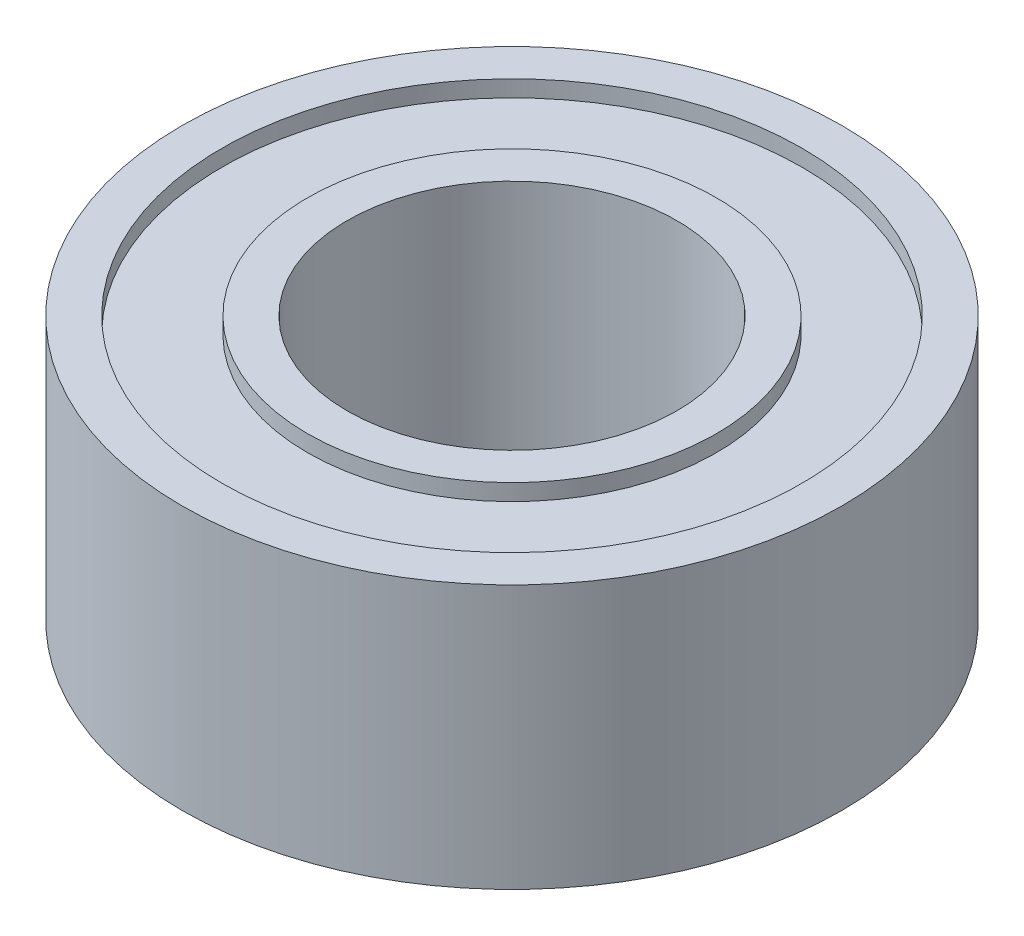
ISO-10303-21;
HEADER;
FILE_DESCRIPTION(('STEP AP214'),'2;1');
FILE_NAME('part.step','',(''),(''),'','','');
FILE_SCHEMA(('AUTOMOTIVE_DESIGN { 1 0 10303 214 1 1 1 1 }'));
ENDSEC;
DATA;
#1=APPLICATION_CONTEXT('core data for automotive mechanical design processes');
#2=APPLICATION_PROTOCOL_DEFINITION('international standard','automotive_design',2000,#1);
#3=PRODUCT_CONTEXT('',#1,'mechanical');
#4=PRODUCT('Part','Part','',(#3));
#5=PRODUCT_RELATED_PRODUCT_CATEGORY('part','',(#4));
#6=PRODUCT_DEFINITION_FORMATION('','',#4);
#7=PRODUCT_DEFINITION_CONTEXT('part definition',#1,'design');
#8=PRODUCT_DEFINITION('design','',#6,#7);
#9=PRODUCT_DEFINITION_SHAPE('','',#8);
#10=(LENGTH_UNIT() NAMED_UNIT(*) SI_UNIT(.MILLI.,.METRE.));
#11=(NAMED_UNIT(*) PLANE_ANGLE_UNIT() SI_UNIT($,.RADIAN.));
#12=(NAMED_UNIT(*) SI_UNIT($,.STERADIAN.) SOLID_ANGLE_UNIT());
#13=UNCERTAINTY_MEASURE_WITH_UNIT(LENGTH_MEASURE(1.E-05),#10,'distance_accuracy_value','');
#14=(GEOMETRIC_REPRESENTATION_CONTEXT(3) GLOBAL_UNCERTAINTY_ASSIGNED_CONTEXT((#13)) GLOBAL_UNIT_ASSIGNED_CONTEXT((#10,
#11,#12)) REPRESENTATION_CONTEXT('',''));
#15=CARTESIAN_POINT('',(0.,0.,0.));
#16=DIRECTION('',(0.,0.,1.));
#17=DIRECTION('',(1.,0.,0.));
#18=AXIS2_PLACEMENT_3D('',#15,#16,#17);
#19=CARTESIAN_POINT('',(0.,-2.,0.));
#20=DIRECTION('',(0.,1.,0.));
#21=DIRECTION('',(0.,0.,1.));
#22=AXIS2_PLACEMENT_3D('',#19,#20,#21);
#23=PLANE('',#22);
#24=CARTESIAN_POINT('',(0.,-2.,0.));
#25=DIRECTION('',(0.,1.,0.));
#26=DIRECTION('',(0.,0.,1.));
#27=AXIS2_PLACEMENT_3D('',#24,#25,#26);
#28=CIRCLE('',#27,2.5);
#29=CARTESIAN_POINT('',(0.,-2.,2.5));
#30=VERTEX_POINT('',#29);
#31=EDGE_CURVE('E45',#30,#30,#28,.T.);
#32=ORIENTED_EDGE('',*,*,#31,.T.);
#33=EDGE_LOOP('',(#32));
#34=FACE_BOUND('',#33,.T.);
#35=CARTESIAN_POINT('',(0.,-2.,0.));
#36=DIRECTION('',(0.,1.,0.));
#37=DIRECTION('',(0.,0.,1.));
#38=AXIS2_PLACEMENT_3D('',#35,#36,#37);
#39=CIRCLE('',#38,3.1);
#40=CARTESIAN_POINT('',(0.,-2.,3.1));
#41=VERTEX_POINT('',#40);
#42=EDGE_CURVE('E69',#41,#41,#39,.T.);
#43=ORIENTED_EDGE('',*,*,#42,.F.);
#44=EDGE_LOOP('',(#43));
#45=FACE_BOUND('',#44,.T.);
#46=ADVANCED_FACE('F32',(#34,#45),#23,.F.);
#47=CARTESIAN_POINT('',(0.,2.,0.));
#48=DIRECTION('',(0.,1.,0.));
#49=DIRECTION('',(0.,0.,1.));
#50=AXIS2_PLACEMENT_3D('',#47,#48,#49);
#51=PLANE('',#50);
#52=CARTESIAN_POINT('',(0.,2.,0.));
#53=DIRECTION('',(0.,1.,0.));
#54=DIRECTION('',(0.,0.,1.));
#55=AXIS2_PLACEMENT_3D('',#52,#53,#54);
#56=CIRCLE('',#55,2.5);
#57=CARTESIAN_POINT('',(0.,2.,2.5));
#58=VERTEX_POINT('',#57);
#59=EDGE_CURVE('E43',#58,#58,#56,.T.);
#60=ORIENTED_EDGE('',*,*,#59,.F.);
#61=EDGE_LOOP('',(#60));
#62=FACE_BOUND('',#61,.T.);
#63=CARTESIAN_POINT('',(0.,2.,0.));
#64=DIRECTION('',(0.,1.,0.));
#65=DIRECTION('',(0.,0.,1.));
#66=AXIS2_PLACEMENT_3D('',#63,#64,#65);
#67=CIRCLE('',#66,3.1);
#68=CARTESIAN_POINT('',(0.,2.,3.1));
#69=VERTEX_POINT('',#68);
#70=EDGE_CURVE('E57',#69,#69,#67,.T.);
#71=ORIENTED_EDGE('',*,*,#70,.T.);
#72=EDGE_LOOP('',(#71));
#73=FACE_BOUND('',#72,.T.);
#74=ADVANCED_FACE('F85',(#62,#73),#51,.T.);
#75=CARTESIAN_POINT('',(0.,2.,0.));
#76=DIRECTION('',(0.,1.,0.));
#77=DIRECTION('',(0.,0.,1.));
#78=AXIS2_PLACEMENT_3D('',#75,#76,#77);
#79=CIRCLE('',#78,4.4);
#80=CARTESIAN_POINT('',(0.,2.,4.4));
#81=VERTEX_POINT('',#80);
#82=EDGE_CURVE('E51',#81,#81,#79,.T.);
#83=ORIENTED_EDGE('',*,*,#82,.F.);
#84=EDGE_LOOP('',(#83));
#85=FACE_BOUND('',#84,.T.);
#86=CARTESIAN_POINT('',(0.,2.,0.));
#87=DIRECTION('',(0.,1.,0.));
#88=DIRECTION('',(0.,0.,1.));
#89=AXIS2_PLACEMENT_3D('',#86,#87,#88);
#90=CIRCLE('',#89,5.);
#91=CARTESIAN_POINT('',(0.,2.,5.));
#92=VERTEX_POINT('',#91);
#93=EDGE_CURVE('E10',#92,#92,#90,.T.);
#94=ORIENTED_EDGE('',*,*,#93,.T.);
#95=EDGE_LOOP('',(#94));
#96=FACE_BOUND('',#95,.T.);
#97=ADVANCED_FACE('F91',(#85,#96),#51,.T.);
#98=CARTESIAN_POINT('',(0.,-2.,0.));
#99=DIRECTION('',(0.,1.,0.));
#100=DIRECTION('',(0.,0.,1.));
#101=AXIS2_PLACEMENT_3D('',#98,#99,#100);
#102=CIRCLE('',#101,4.4);
#103=CARTESIAN_POINT('',(0.,-2.,4.4));
#104=VERTEX_POINT('',#103);
#105=EDGE_CURVE('E63',#104,#104,#102,.T.);
#106=ORIENTED_EDGE('',*,*,#105,.T.);
#107=EDGE_LOOP('',(#106));
#108=FACE_BOUND('',#107,.T.);
#109=CARTESIAN_POINT('',(0.,-2.,0.));
#110=DIRECTION('',(0.,1.,0.));
#111=DIRECTION('',(0.,0.,1.));
#112=AXIS2_PLACEMENT_3D('',#109,#110,#111);
#113=CIRCLE('',#112,5.);
#114=CARTESIAN_POINT('',(0.,-2.,5.));
#115=VERTEX_POINT('',#114);
#116=EDGE_CURVE('E36',#115,#115,#113,.T.);
#117=ORIENTED_EDGE('',*,*,#116,.F.);
#118=EDGE_LOOP('',(#117));
#119=FACE_BOUND('',#118,.T.);
#120=ADVANCED_FACE('F87',(#108,#119),#23,.F.);
#121=CARTESIAN_POINT('',(0.,2.,0.));
#122=DIRECTION('',(0.,-1.,0.));
#123=DIRECTION('',(0.,0.,-1.));
#124=AXIS2_PLACEMENT_3D('',#121,#122,#123);
#125=CYLINDRICAL_SURFACE('',#124,5.);
#126=ORIENTED_EDGE('',*,*,#93,.F.);
#127=EDGE_LOOP('',(#126));
#128=FACE_BOUND('',#127,.T.);
#129=ORIENTED_EDGE('',*,*,#116,.T.);
#130=EDGE_LOOP('',(#129));
#131=FACE_BOUND('',#130,.T.);
#132=ADVANCED_FACE('F34',(#128,#131),#125,.T.);
#133=CARTESIAN_POINT('',(0.,2.,0.));
#134=DIRECTION('',(0.,-1.,0.));
#135=DIRECTION('',(0.,0.,-1.));
#136=AXIS2_PLACEMENT_3D('',#133,#134,#135);
#137=CYLINDRICAL_SURFACE('',#136,2.5);
#138=ORIENTED_EDGE('',*,*,#59,.T.);
#139=EDGE_LOOP('',(#138));
#140=FACE_BOUND('',#139,.T.);
#141=ORIENTED_EDGE('',*,*,#31,.F.);
#142=EDGE_LOOP('',(#141));
#143=FACE_BOUND('',#142,.T.);
#144=ADVANCED_FACE('F100',(#140,#143),#137,.F.);
#145=CARTESIAN_POINT('',(0.,1.75,0.));
#146=DIRECTION('',(0.,1.,0.));
#147=DIRECTION('',(0.,0.,1.));
#148=AXIS2_PLACEMENT_3D('',#145,#146,#147);
#149=CYLINDRICAL_SURFACE('',#148,4.4);
#150=CARTESIAN_POINT('',(0.,1.75,0.));
#151=DIRECTION('',(0.,1.,0.));
#152=DIRECTION('',(0.,0.,1.));
#153=AXIS2_PLACEMENT_3D('',#150,#151,#152);
#154=CIRCLE('',#153,4.4);
#155=CARTESIAN_POINT('',(0.,1.75,4.4));
#156=VERTEX_POINT('',#155);
#157=EDGE_CURVE('E48',#156,#156,#154,.T.);
#158=ORIENTED_EDGE('',*,*,#157,.F.);
#159=EDGE_LOOP('',(#158));
#160=FACE_BOUND('',#159,.T.);
#161=ORIENTED_EDGE('',*,*,#82,.T.);
#162=EDGE_LOOP('',(#161));
#163=FACE_BOUND('',#162,.T.);
#164=ADVANCED_FACE('F124',(#160,#163),#149,.F.);
#165=CARTESIAN_POINT('',(0.,1.75,0.));
#166=DIRECTION('',(0.,1.,0.));
#167=DIRECTION('',(0.,0.,1.));
#168=AXIS2_PLACEMENT_3D('',#165,#166,#167);
#169=PLANE('',#168);
#170=CARTESIAN_POINT('',(0.,1.75,0.));
#171=DIRECTION('',(0.,1.,0.));
#172=DIRECTION('',(0.,0.,1.));
#173=AXIS2_PLACEMENT_3D('',#170,#171,#172);
#174=CIRCLE('',#173,3.1);
#175=CARTESIAN_POINT('',(0.,1.75,3.1));
#176=VERTEX_POINT('',#175);
#177=EDGE_CURVE('E54',#176,#176,#174,.T.);
#178=ORIENTED_EDGE('',*,*,#177,.F.);
#179=EDGE_LOOP('',(#178));
#180=FACE_BOUND('',#179,.T.);
#181=ORIENTED_EDGE('',*,*,#157,.T.);
#182=EDGE_LOOP('',(#181));
#183=FACE_BOUND('',#182,.T.);
#184=ADVANCED_FACE('F120',(#180,#183),#169,.T.);
#185=CARTESIAN_POINT('',(0.,1.75,0.));
#186=DIRECTION('',(0.,1.,0.));
#187=DIRECTION('',(0.,0.,1.));
#188=AXIS2_PLACEMENT_3D('',#185,#186,#187);
#189=CYLINDRICAL_SURFACE('',#188,3.1);
#190=ORIENTED_EDGE('',*,*,#177,.T.);
#191=EDGE_LOOP('',(#190));
#192=FACE_BOUND('',#191,.T.);
#193=ORIENTED_EDGE('',*,*,#70,.F.);
#194=EDGE_LOOP('',(#193));
#195=FACE_BOUND('',#194,.T.);
#196=ADVANCED_FACE('F114',(#192,#195),#189,.T.);
#197=CARTESIAN_POINT('',(0.,-1.75,0.));
#198=DIRECTION('',(0.,-1.,0.));
#199=DIRECTION('',(0.,0.,1.));
#200=AXIS2_PLACEMENT_3D('',#197,#198,#199);
#201=PLANE('',#200);
#202=CARTESIAN_POINT('',(0.,-1.75,0.));
#203=DIRECTION('',(0.,1.,0.));
#204=DIRECTION('',(0.,0.,1.));
#205=AXIS2_PLACEMENT_3D('',#202,#203,#204);
#206=CIRCLE('',#205,4.4);
#207=CARTESIAN_POINT('',(0.,-1.75,4.4));
#208=VERTEX_POINT('',#207);
#209=EDGE_CURVE('E60',#208,#208,#206,.T.);
#210=ORIENTED_EDGE('',*,*,#209,.F.);
#211=EDGE_LOOP('',(#210));
#212=FACE_BOUND('',#211,.T.);
#213=CARTESIAN_POINT('',(0.,-1.75,0.));
#214=DIRECTION('',(0.,1.,0.));
#215=DIRECTION('',(0.,0.,1.));
#216=AXIS2_PLACEMENT_3D('',#213,#214,#215);
#217=CIRCLE('',#216,3.1);
#218=CARTESIAN_POINT('',(0.,-1.75,3.1));
#219=VERTEX_POINT('',#218);
#220=EDGE_CURVE('E66',#219,#219,#217,.T.);
#221=ORIENTED_EDGE('',*,*,#220,.T.);
#222=EDGE_LOOP('',(#221));
#223=FACE_BOUND('',#222,.T.);
#224=ADVANCED_FACE('F75',(#212,#223),#201,.T.);
#225=CARTESIAN_POINT('',(0.,-1.75,0.));
#226=DIRECTION('',(0.,-1.,0.));
#227=DIRECTION('',(0.,0.,-1.));
#228=AXIS2_PLACEMENT_3D('',#225,#226,#227);
#229=CYLINDRICAL_SURFACE('',#228,4.4);
#230=ORIENTED_EDGE('',*,*,#209,.T.);
#231=EDGE_LOOP('',(#230));
#232=FACE_BOUND('',#231,.T.);
#233=ORIENTED_EDGE('',*,*,#105,.F.);
#234=EDGE_LOOP('',(#233));
#235=FACE_BOUND('',#234,.T.);
#236=ADVANCED_FACE('F80',(#232,#235),#229,.F.);
#237=CARTESIAN_POINT('',(0.,-1.75,0.));
#238=DIRECTION('',(0.,-1.,0.));
#239=DIRECTION('',(0.,0.,-1.));
#240=AXIS2_PLACEMENT_3D('',#237,#238,#239);
#241=CYLINDRICAL_SURFACE('',#240,3.1);
#242=ORIENTED_EDGE('',*,*,#220,.F.);
#243=EDGE_LOOP('',(#242));
#244=FACE_BOUND('',#243,.T.);
#245=ORIENTED_EDGE('',*,*,#42,.T.);
#246=EDGE_LOOP('',(#245));
#247=FACE_BOUND('',#246,.T.);
#248=ADVANCED_FACE('F77',(#244,#247),#241,.T.);
#249=CLOSED_SHELL('',(#46,#74,#97,#120,#132,#144,#164,#184,#196,#224,#236,#248));
#250=MANIFOLD_SOLID_BREP('B2',#249);
#251=ADVANCED_BREP_SHAPE_REPRESENTATION('',(#18,#250),#14);
#252=SHAPE_DEFINITION_REPRESENTATION(#9,#251);
ENDSEC;
END-ISO-10303-21;
